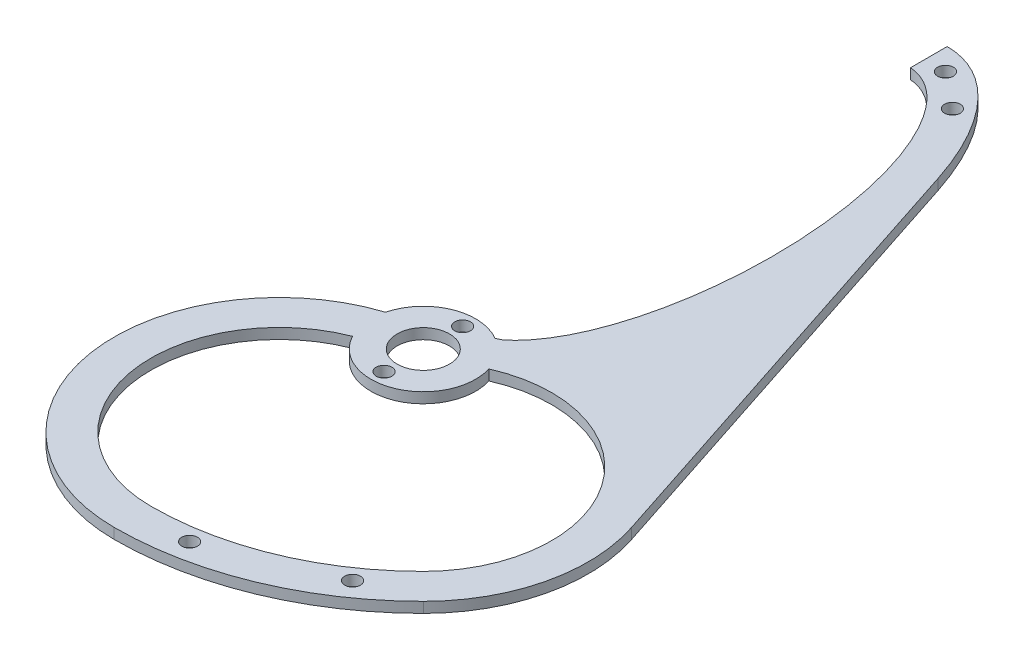
ISO-10303-21;
HEADER;
FILE_DESCRIPTION(('STEP AP214'),'2;1');
FILE_NAME('part.step','',(''),(''),'','','');
FILE_SCHEMA(('AUTOMOTIVE_DESIGN { 1 0 10303 214 1 1 1 1 }'));
ENDSEC;
DATA;
#1=APPLICATION_CONTEXT('core data for automotive mechanical design processes');
#2=APPLICATION_PROTOCOL_DEFINITION('international standard','automotive_design',2000,#1);
#3=PRODUCT_CONTEXT('',#1,'mechanical');
#4=PRODUCT('Part','Part','',(#3));
#5=PRODUCT_RELATED_PRODUCT_CATEGORY('part','',(#4));
#6=PRODUCT_DEFINITION_FORMATION('','',#4);
#7=PRODUCT_DEFINITION_CONTEXT('part definition',#1,'design');
#8=PRODUCT_DEFINITION('design','',#6,#7);
#9=PRODUCT_DEFINITION_SHAPE('','',#8);
#10=(LENGTH_UNIT() NAMED_UNIT(*) SI_UNIT(.MILLI.,.METRE.));
#11=(NAMED_UNIT(*) PLANE_ANGLE_UNIT() SI_UNIT($,.RADIAN.));
#12=(NAMED_UNIT(*) SI_UNIT($,.STERADIAN.) SOLID_ANGLE_UNIT());
#13=UNCERTAINTY_MEASURE_WITH_UNIT(LENGTH_MEASURE(1.E-05),#10,'distance_accuracy_value','');
#14=(GEOMETRIC_REPRESENTATION_CONTEXT(3) GLOBAL_UNCERTAINTY_ASSIGNED_CONTEXT((#13)) GLOBAL_UNIT_ASSIGNED_CONTEXT((#10,
#11,#12)) REPRESENTATION_CONTEXT('',''));
#15=CARTESIAN_POINT('',(0.,0.,0.));
#16=DIRECTION('',(0.,0.,1.));
#17=DIRECTION('',(1.,0.,0.));
#18=AXIS2_PLACEMENT_3D('',#15,#16,#17);
#19=CARTESIAN_POINT('',(0.,2.,-50.));
#20=DIRECTION('',(0.,1.,0.));
#21=DIRECTION('',(0.,0.,1.));
#22=AXIS2_PLACEMENT_3D('',#19,#20,#21);
#23=PLANE('',#22);
#24=CARTESIAN_POINT('',(10.7802293046451,2.,-90.2323634821783));
#25=DIRECTION('',(0.,-1.,0.));
#26=DIRECTION('',(0.,0.,-1.));
#27=AXIS2_PLACEMENT_3D('',#24,#25,#26);
#28=CIRCLE('',#27,1.5);
#29=CARTESIAN_POINT('',(10.7802293046451,2.,-91.7323634821783));
#30=VERTEX_POINT('',#29);
#31=EDGE_CURVE('E488',#30,#30,#28,.T.);
#32=ORIENTED_EDGE('',*,*,#31,.T.);
#33=EDGE_LOOP('',(#32));
#34=FACE_BOUND('',#33,.T.);
#35=CARTESIAN_POINT('',(3.99729247476001,2.,-95.6892620559412));
#36=DIRECTION('',(0.,-1.,0.));
#37=DIRECTION('',(0.,0.,-1.));
#38=AXIS2_PLACEMENT_3D('',#35,#36,#37);
#39=CIRCLE('',#38,1.5);
#40=CARTESIAN_POINT('',(3.99729247476001,2.,-97.1892620559412));
#41=VERTEX_POINT('',#40);
#42=EDGE_CURVE('E496',#41,#41,#39,.T.);
#43=ORIENTED_EDGE('',*,*,#42,.T.);
#44=EDGE_LOOP('',(#43));
#45=FACE_BOUND('',#44,.T.);
#46=CARTESIAN_POINT('',(0.,2.,7.5));
#47=DIRECTION('',(0.,1.,0.));
#48=DIRECTION('',(0.,0.,1.));
#49=AXIS2_PLACEMENT_3D('',#46,#47,#48);
#50=CIRCLE('',#49,1.5);
#51=CARTESIAN_POINT('',(0.,2.,9.));
#52=VERTEX_POINT('',#51);
#53=EDGE_CURVE('E508',#52,#52,#50,.T.);
#54=ORIENTED_EDGE('',*,*,#53,.F.);
#55=EDGE_LOOP('',(#54));
#56=FACE_BOUND('',#55,.T.);
#57=CARTESIAN_POINT('',(0.,2.,0.));
#58=DIRECTION('',(0.,1.,0.));
#59=DIRECTION('',(0.,0.,1.));
#60=AXIS2_PLACEMENT_3D('',#57,#58,#59);
#61=CIRCLE('',#60,52.);
#62=CARTESIAN_POINT('',(0.,2.,52.));
#63=VERTEX_POINT('',#62);
#64=CARTESIAN_POINT('',(36.7695526217005,2.,36.7695526217005));
#65=VERTEX_POINT('',#64);
#66=EDGE_CURVE('E138',#63,#65,#61,.T.);
#67=ORIENTED_EDGE('',*,*,#66,.F.);
#68=CARTESIAN_POINT('',(0.,2.,27.5));
#69=DIRECTION('',(0.,1.,0.));
#70=DIRECTION('',(0.,0.,-1.));
#71=AXIS2_PLACEMENT_3D('',#68,#69,#70);
#72=CIRCLE('',#71,24.5);
#73=CARTESIAN_POINT('',(-8.85071785854508,2.,4.65454545454543));
#74=VERTEX_POINT('',#73);
#75=EDGE_CURVE('E130',#74,#63,#72,.T.);
#76=ORIENTED_EDGE('',*,*,#75,.F.);
#77=CARTESIAN_POINT('',(0.,2.,0.));
#78=DIRECTION('',(0.,-1.,0.));
#79=DIRECTION('',(0.,0.,1.));
#80=AXIS2_PLACEMENT_3D('',#77,#78,#79);
#81=CIRCLE('',#80,9.99999999999992);
#82=CARTESIAN_POINT('',(9.54966327039619,2.,-2.96714196189605));
#83=VERTEX_POINT('',#82);
#84=EDGE_CURVE('E153',#83,#74,#81,.T.);
#85=ORIENTED_EDGE('',*,*,#84,.F.);
#86=CARTESIAN_POINT('',(19.4454364826301,2.,19.44543648263));
#87=DIRECTION('',(0.,1.,0.));
#88=DIRECTION('',(0.,0.,1.));
#89=AXIS2_PLACEMENT_3D('',#86,#87,#88);
#90=CIRCLE('',#89,24.5);
#91=EDGE_CURVE('E151',#65,#83,#90,.T.);
#92=ORIENTED_EDGE('',*,*,#91,.F.);
#93=EDGE_LOOP('',(#67,#76,#85,#92));
#94=FACE_BOUND('',#93,.T.);
#95=CARTESIAN_POINT('',(31.5467039993079,2.,45.0533624358943));
#96=DIRECTION('',(0.,1.,0.));
#97=DIRECTION('',(0.,0.,-1.));
#98=AXIS2_PLACEMENT_3D('',#95,#96,#97);
#99=CIRCLE('',#98,1.5);
#100=CARTESIAN_POINT('',(31.5467039993079,2.,43.5533624358943));
#101=VERTEX_POINT('',#100);
#102=EDGE_CURVE('E169',#101,#101,#99,.T.);
#103=ORIENTED_EDGE('',*,*,#102,.F.);
#104=EDGE_LOOP('',(#103));
#105=FACE_BOUND('',#104,.T.);
#106=CARTESIAN_POINT('',(0.,2.,27.5));
#107=DIRECTION('',(0.,1.,0.));
#108=DIRECTION('',(0.,0.,-1.));
#109=AXIS2_PLACEMENT_3D('',#106,#107,#108);
#110=CIRCLE('',#109,31.5);
#111=CARTESIAN_POINT('',(-9.68945921270682,2.,-2.4727272727273));
#112=VERTEX_POINT('',#111);
#113=CARTESIAN_POINT('',(0.,2.,59.));
#114=VERTEX_POINT('',#113);
#115=EDGE_CURVE('E181',#112,#114,#110,.T.);
#116=ORIENTED_EDGE('',*,*,#115,.T.);
#117=CARTESIAN_POINT('',(0.,2.,0.));
#118=DIRECTION('',(0.,1.,0.));
#119=DIRECTION('',(0.,0.,1.));
#120=AXIS2_PLACEMENT_3D('',#117,#118,#119);
#121=CIRCLE('',#120,59.);
#122=CARTESIAN_POINT('',(41.7193000900064,2.,41.7193000900062));
#123=VERTEX_POINT('',#122);
#124=EDGE_CURVE('E184',#114,#123,#121,.T.);
#125=ORIENTED_EDGE('',*,*,#124,.T.);
#126=CARTESIAN_POINT('',(19.4454364826301,2.,19.44543648263));
#127=DIRECTION('',(0.,1.,0.));
#128=DIRECTION('',(0.,0.,1.));
#129=AXIS2_PLACEMENT_3D('',#126,#127,#128);
#130=CIRCLE('',#129,31.5);
#131=CARTESIAN_POINT('',(49.3845442563364,2.,9.65259084336872));
#132=VERTEX_POINT('',#131);
#133=EDGE_CURVE('E187',#123,#132,#130,.T.);
#134=ORIENTED_EDGE('',*,*,#133,.T.);
#135=DIRECTION('',(-0.310883988547977,0.,-0.950447865831946));
#136=VECTOR('',#135,1.);
#137=CARTESIAN_POINT('',(20.9205105577853,2.,-77.3688740063126));
#138=LINE('',#137,#136);
#139=CARTESIAN_POINT('',(20.9205105577853,2.,-77.3688740063126));
#140=VERTEX_POINT('',#139);
#141=EDGE_CURVE('E189',#132,#140,#138,.T.);
#142=ORIENTED_EDGE('',*,*,#141,.T.);
#143=CARTESIAN_POINT('',(0.,2.,-50.));
#144=DIRECTION('',(0.,1.,0.));
#145=DIRECTION('',(-7.9671973330076E-05,0.,-0.999999996826188));
#146=AXIS2_PLACEMENT_3D('',#143,#144,#145);
#147=ELLIPSE('',#146,50.0000004760718,25.0000000793453);
#148=CARTESIAN_POINT('',(0.,2.,-100.));
#149=VERTEX_POINT('',#148);
#150=EDGE_CURVE('E191',#140,#149,#147,.T.);
#151=ORIENTED_EDGE('',*,*,#150,.T.);
#152=DIRECTION('',(0.,0.,1.));
#153=VECTOR('',#152,1.);
#154=CARTESIAN_POINT('',(0.,2.,-93.0000000000292));
#155=LINE('',#154,#153);
#156=CARTESIAN_POINT('',(0.,2.,-93.0000000000292));
#157=VERTEX_POINT('',#156);
#158=EDGE_CURVE('E194',#149,#157,#155,.T.);
#159=ORIENTED_EDGE('',*,*,#158,.T.);
#160=CARTESIAN_POINT('',(0.,2.,-50.));
#161=DIRECTION('',(0.,-1.,0.));
#162=DIRECTION('',(0.0150081111125231,0.,0.999887371957879));
#163=AXIS2_PLACEMENT_3D('',#160,#161,#162);
#164=ELLIPSE('',#163,43.0227949668846,18.007170315413);
#165=CARTESIAN_POINT('',(6.03243215555724,2.,-9.05616548852738));
#166=VERTEX_POINT('',#165);
#167=EDGE_CURVE('E243',#157,#166,#164,.T.);
#168=ORIENTED_EDGE('',*,*,#167,.T.);
#169=CARTESIAN_POINT('',(19.4454364826301,2.,19.44543648263));
#170=DIRECTION('',(0.,1.,0.));
#171=DIRECTION('',(0.,0.,1.));
#172=AXIS2_PLACEMENT_3D('',#169,#170,#171);
#173=CIRCLE('',#172,31.5000000000029);
#174=CARTESIAN_POINT('',(5.10300009276374,2.,-8.5999645379084));
#175=VERTEX_POINT('',#174);
#176=EDGE_CURVE('E246',#166,#175,#173,.T.);
#177=ORIENTED_EDGE('',*,*,#176,.T.);
#178=CARTESIAN_POINT('',(0.,2.,0.));
#179=DIRECTION('',(0.,1.,0.));
#180=DIRECTION('',(0.,0.,1.));
#181=AXIS2_PLACEMENT_3D('',#178,#179,#180);
#182=CIRCLE('',#181,9.99999999999992);
#183=EDGE_CURVE('E248',#175,#112,#182,.T.);
#184=ORIENTED_EDGE('',*,*,#183,.T.);
#185=EDGE_LOOP('',(#116,#125,#134,#142,#151,#159,#168,#177,#184));
#186=FACE_BOUND('',#185,.T.);
#187=CARTESIAN_POINT('',(9.55064977168081,2.,54.1644264156715));
#188=DIRECTION('',(0.,1.,0.));
#189=DIRECTION('',(0.,0.,1.));
#190=AXIS2_PLACEMENT_3D('',#187,#188,#189);
#191=CIRCLE('',#190,1.5);
#192=CARTESIAN_POINT('',(9.55064977168081,2.,55.6644264156715));
#193=VERTEX_POINT('',#192);
#194=EDGE_CURVE('E175',#193,#193,#191,.T.);
#195=ORIENTED_EDGE('',*,*,#194,.F.);
#196=EDGE_LOOP('',(#195));
#197=FACE_BOUND('',#196,.T.);
#198=CARTESIAN_POINT('',(0.,2.,0.));
#199=DIRECTION('',(0.,1.,0.));
#200=DIRECTION('',(0.,0.,1.));
#201=AXIS2_PLACEMENT_3D('',#198,#199,#200);
#202=CIRCLE('',#201,5.);
#203=CARTESIAN_POINT('',(0.,2.,5.));
#204=VERTEX_POINT('',#203);
#205=EDGE_CURVE('E159',#204,#204,#202,.T.);
#206=ORIENTED_EDGE('',*,*,#205,.F.);
#207=EDGE_LOOP('',(#206));
#208=FACE_BOUND('',#207,.T.);
#209=CARTESIAN_POINT('',(0.,2.,-7.5));
#210=DIRECTION('',(0.,1.,0.));
#211=DIRECTION('',(0.,0.,1.));
#212=AXIS2_PLACEMENT_3D('',#209,#210,#211);
#213=CIRCLE('',#212,1.5);
#214=CARTESIAN_POINT('',(0.,2.,-6.));
#215=VERTEX_POINT('',#214);
#216=EDGE_CURVE('E502',#215,#215,#213,.T.);
#217=ORIENTED_EDGE('',*,*,#216,.F.);
#218=EDGE_LOOP('',(#217));
#219=FACE_BOUND('',#218,.T.);
#220=ADVANCED_FACE('F35',(#34,#45,#56,#94,#105,#186,#197,#208,#219),#23,.T.);
#221=CARTESIAN_POINT('',(0.,0.,-50.));
#222=DIRECTION('',(0.,1.,0.));
#223=DIRECTION('',(0.,0.,1.));
#224=AXIS2_PLACEMENT_3D('',#221,#222,#223);
#225=PLANE('',#224);
#226=CARTESIAN_POINT('',(10.7802293046451,0.,-90.2323634821783));
#227=DIRECTION('',(0.,-1.,0.));
#228=DIRECTION('',(0.,0.,-1.));
#229=AXIS2_PLACEMENT_3D('',#226,#227,#228);
#230=CIRCLE('',#229,1.5);
#231=CARTESIAN_POINT('',(10.7802293046451,0.,-91.7323634821783));
#232=VERTEX_POINT('',#231);
#233=EDGE_CURVE('E491',#232,#232,#230,.T.);
#234=ORIENTED_EDGE('',*,*,#233,.F.);
#235=EDGE_LOOP('',(#234));
#236=FACE_BOUND('',#235,.T.);
#237=CARTESIAN_POINT('',(3.99729247476001,0.,-95.6892620559412));
#238=DIRECTION('',(0.,-1.,0.));
#239=DIRECTION('',(0.,0.,-1.));
#240=AXIS2_PLACEMENT_3D('',#237,#238,#239);
#241=CIRCLE('',#240,1.5);
#242=CARTESIAN_POINT('',(3.99729247476001,0.,-97.1892620559412));
#243=VERTEX_POINT('',#242);
#244=EDGE_CURVE('E493',#243,#243,#241,.T.);
#245=ORIENTED_EDGE('',*,*,#244,.F.);
#246=EDGE_LOOP('',(#245));
#247=FACE_BOUND('',#246,.T.);
#248=CARTESIAN_POINT('',(31.5467039993079,0.,45.0533624358943));
#249=DIRECTION('',(0.,1.,0.));
#250=DIRECTION('',(0.,0.,-1.));
#251=AXIS2_PLACEMENT_3D('',#248,#249,#250);
#252=CIRCLE('',#251,1.5);
#253=CARTESIAN_POINT('',(31.5467039993079,0.,43.5533624358943));
#254=VERTEX_POINT('',#253);
#255=EDGE_CURVE('E146',#254,#254,#252,.T.);
#256=ORIENTED_EDGE('',*,*,#255,.T.);
#257=EDGE_LOOP('',(#256));
#258=FACE_BOUND('',#257,.T.);
#259=CARTESIAN_POINT('',(9.55064977168081,0.,54.1644264156715));
#260=DIRECTION('',(0.,1.,0.));
#261=DIRECTION('',(0.,0.,1.));
#262=AXIS2_PLACEMENT_3D('',#259,#260,#261);
#263=CIRCLE('',#262,1.5);
#264=CARTESIAN_POINT('',(9.55064977168081,0.,55.6644264156715));
#265=VERTEX_POINT('',#264);
#266=EDGE_CURVE('E172',#265,#265,#263,.T.);
#267=ORIENTED_EDGE('',*,*,#266,.T.);
#268=EDGE_LOOP('',(#267));
#269=FACE_BOUND('',#268,.T.);
#270=CARTESIAN_POINT('',(0.,0.,27.5));
#271=DIRECTION('',(0.,1.,0.));
#272=DIRECTION('',(0.,0.,-1.));
#273=AXIS2_PLACEMENT_3D('',#270,#271,#272);
#274=CIRCLE('',#273,31.5);
#275=CARTESIAN_POINT('',(-9.68945921270682,0.,-2.4727272727273));
#276=VERTEX_POINT('',#275);
#277=CARTESIAN_POINT('',(0.,0.,59.));
#278=VERTEX_POINT('',#277);
#279=EDGE_CURVE('E178',#276,#278,#274,.T.);
#280=ORIENTED_EDGE('',*,*,#279,.F.);
#281=CARTESIAN_POINT('',(0.,0.,0.));
#282=DIRECTION('',(0.,1.,0.));
#283=DIRECTION('',(0.,0.,1.));
#284=AXIS2_PLACEMENT_3D('',#281,#282,#283);
#285=CIRCLE('',#284,9.99999999999992);
#286=CARTESIAN_POINT('',(5.10300009276374,0.,-8.5999645379084));
#287=VERTEX_POINT('',#286);
#288=EDGE_CURVE('E185',#287,#276,#285,.T.);
#289=ORIENTED_EDGE('',*,*,#288,.F.);
#290=CARTESIAN_POINT('',(19.4454364826301,0.,19.44543648263));
#291=DIRECTION('',(0.,1.,0.));
#292=DIRECTION('',(0.,0.,1.));
#293=AXIS2_PLACEMENT_3D('',#290,#291,#292);
#294=CIRCLE('',#293,31.5000000000029);
#295=CARTESIAN_POINT('',(6.03243215555724,0.,-9.05616548852738));
#296=VERTEX_POINT('',#295);
#297=EDGE_CURVE('E265',#296,#287,#294,.T.);
#298=ORIENTED_EDGE('',*,*,#297,.F.);
#299=CARTESIAN_POINT('',(0.,0.,-50.));
#300=DIRECTION('',(0.,-1.,0.));
#301=DIRECTION('',(0.0150081111125231,0.,0.999887371957879));
#302=AXIS2_PLACEMENT_3D('',#299,#300,#301);
#303=ELLIPSE('',#302,43.0227949668846,18.007170315413);
#304=CARTESIAN_POINT('',(0.,0.,-93.0000000000292));
#305=VERTEX_POINT('',#304);
#306=EDGE_CURVE('E263',#305,#296,#303,.T.);
#307=ORIENTED_EDGE('',*,*,#306,.F.);
#308=DIRECTION('',(0.,0.,1.));
#309=VECTOR('',#308,1.);
#310=CARTESIAN_POINT('',(0.,0.,-93.0000000000292));
#311=LINE('',#310,#309);
#312=CARTESIAN_POINT('',(0.,0.,-100.));
#313=VERTEX_POINT('',#312);
#314=EDGE_CURVE('E261',#313,#305,#311,.T.);
#315=ORIENTED_EDGE('',*,*,#314,.F.);
#316=CARTESIAN_POINT('',(0.,0.,-50.));
#317=DIRECTION('',(0.,1.,0.));
#318=DIRECTION('',(-7.9671973330076E-05,0.,-0.999999996826188));
#319=AXIS2_PLACEMENT_3D('',#316,#317,#318);
#320=ELLIPSE('',#319,50.0000004760718,25.0000000793453);
#321=CARTESIAN_POINT('',(20.9205105577853,0.,-77.3688740063126));
#322=VERTEX_POINT('',#321);
#323=EDGE_CURVE('E259',#322,#313,#320,.T.);
#324=ORIENTED_EDGE('',*,*,#323,.F.);
#325=DIRECTION('',(-0.310883988547977,0.,-0.950447865831946));
#326=VECTOR('',#325,1.);
#327=CARTESIAN_POINT('',(20.9205105577853,0.,-77.3688740063126));
#328=LINE('',#327,#326);
#329=CARTESIAN_POINT('',(49.3845442563364,0.,9.65259084336872));
#330=VERTEX_POINT('',#329);
#331=EDGE_CURVE('E257',#330,#322,#328,.T.);
#332=ORIENTED_EDGE('',*,*,#331,.F.);
#333=CARTESIAN_POINT('',(19.4454364826301,0.,19.44543648263));
#334=DIRECTION('',(0.,1.,0.));
#335=DIRECTION('',(0.,0.,1.));
#336=AXIS2_PLACEMENT_3D('',#333,#334,#335);
#337=CIRCLE('',#336,31.5);
#338=CARTESIAN_POINT('',(41.7193000900064,0.,41.7193000900062));
#339=VERTEX_POINT('',#338);
#340=EDGE_CURVE('E255',#339,#330,#337,.T.);
#341=ORIENTED_EDGE('',*,*,#340,.F.);
#342=CARTESIAN_POINT('',(0.,0.,0.));
#343=DIRECTION('',(0.,1.,0.));
#344=DIRECTION('',(0.,0.,1.));
#345=AXIS2_PLACEMENT_3D('',#342,#343,#344);
#346=CIRCLE('',#345,59.);
#347=EDGE_CURVE('E253',#278,#339,#346,.T.);
#348=ORIENTED_EDGE('',*,*,#347,.F.);
#349=EDGE_LOOP('',(#280,#289,#298,#307,#315,#324,#332,#341,#348));
#350=FACE_BOUND('',#349,.T.);
#351=CARTESIAN_POINT('',(0.,0.,27.5));
#352=DIRECTION('',(0.,1.,0.));
#353=DIRECTION('',(0.,0.,-1.));
#354=AXIS2_PLACEMENT_3D('',#351,#352,#353);
#355=CIRCLE('',#354,24.5);
#356=CARTESIAN_POINT('',(-8.85071785854508,0.,4.65454545454543));
#357=VERTEX_POINT('',#356);
#358=CARTESIAN_POINT('',(0.,0.,52.));
#359=VERTEX_POINT('',#358);
#360=EDGE_CURVE('E58',#357,#359,#355,.T.);
#361=ORIENTED_EDGE('',*,*,#360,.T.);
#362=CARTESIAN_POINT('',(0.,0.,0.));
#363=DIRECTION('',(0.,1.,0.));
#364=DIRECTION('',(0.,0.,1.));
#365=AXIS2_PLACEMENT_3D('',#362,#363,#364);
#366=CIRCLE('',#365,52.);
#367=CARTESIAN_POINT('',(36.7695526217005,0.,36.7695526217005));
#368=VERTEX_POINT('',#367);
#369=EDGE_CURVE('E145',#359,#368,#366,.T.);
#370=ORIENTED_EDGE('',*,*,#369,.T.);
#371=CARTESIAN_POINT('',(19.4454364826301,0.,19.44543648263));
#372=DIRECTION('',(0.,1.,0.));
#373=DIRECTION('',(0.,0.,1.));
#374=AXIS2_PLACEMENT_3D('',#371,#372,#373);
#375=CIRCLE('',#374,24.5);
#376=CARTESIAN_POINT('',(9.5496632703962,0.,-2.96714196189605));
#377=VERTEX_POINT('',#376);
#378=EDGE_CURVE('E161',#368,#377,#375,.T.);
#379=ORIENTED_EDGE('',*,*,#378,.T.);
#380=CARTESIAN_POINT('',(0.,0.,0.));
#381=DIRECTION('',(0.,-1.,0.));
#382=DIRECTION('',(0.,0.,1.));
#383=AXIS2_PLACEMENT_3D('',#380,#381,#382);
#384=CIRCLE('',#383,9.99999999999992);
#385=EDGE_CURVE('E139',#377,#357,#384,.T.);
#386=ORIENTED_EDGE('',*,*,#385,.T.);
#387=EDGE_LOOP('',(#361,#370,#379,#386));
#388=FACE_BOUND('',#387,.T.);
#389=CARTESIAN_POINT('',(0.,0.,0.));
#390=DIRECTION('',(0.,1.,0.));
#391=DIRECTION('',(0.,0.,1.));
#392=AXIS2_PLACEMENT_3D('',#389,#390,#391);
#393=CIRCLE('',#392,5.);
#394=CARTESIAN_POINT('',(0.,0.,5.));
#395=VERTEX_POINT('',#394);
#396=EDGE_CURVE('E511',#395,#395,#393,.T.);
#397=ORIENTED_EDGE('',*,*,#396,.T.);
#398=EDGE_LOOP('',(#397));
#399=FACE_BOUND('',#398,.T.);
#400=CARTESIAN_POINT('',(0.,0.,7.5));
#401=DIRECTION('',(0.,1.,0.));
#402=DIRECTION('',(0.,0.,1.));
#403=AXIS2_PLACEMENT_3D('',#400,#401,#402);
#404=CIRCLE('',#403,1.5);
#405=CARTESIAN_POINT('',(0.,0.,9.));
#406=VERTEX_POINT('',#405);
#407=EDGE_CURVE('E505',#406,#406,#404,.T.);
#408=ORIENTED_EDGE('',*,*,#407,.T.);
#409=EDGE_LOOP('',(#408));
#410=FACE_BOUND('',#409,.T.);
#411=CARTESIAN_POINT('',(0.,0.,-7.5));
#412=DIRECTION('',(0.,1.,0.));
#413=DIRECTION('',(0.,0.,1.));
#414=AXIS2_PLACEMENT_3D('',#411,#412,#413);
#415=CIRCLE('',#414,1.5);
#416=CARTESIAN_POINT('',(0.,0.,-6.));
#417=VERTEX_POINT('',#416);
#418=EDGE_CURVE('E499',#417,#417,#415,.T.);
#419=ORIENTED_EDGE('',*,*,#418,.T.);
#420=EDGE_LOOP('',(#419));
#421=FACE_BOUND('',#420,.T.);
#422=ADVANCED_FACE('F217',(#236,#247,#258,#269,#350,#388,#399,#410,#421),#225,.F.);
#423=CARTESIAN_POINT('',(0.,2.,27.5));
#424=DIRECTION('',(0.,-1.,0.));
#425=DIRECTION('',(0.,0.,-1.));
#426=AXIS2_PLACEMENT_3D('',#423,#424,#425);
#427=CYLINDRICAL_SURFACE('',#426,31.5);
#428=ORIENTED_EDGE('',*,*,#279,.T.);
#429=DIRECTION('',(0.,-1.,0.));
#430=VECTOR('',#429,1.);
#431=CARTESIAN_POINT('',(0.,2.,59.));
#432=LINE('',#431,#430);
#433=EDGE_CURVE('E11',#114,#278,#432,.T.);
#434=ORIENTED_EDGE('',*,*,#433,.F.);
#435=ORIENTED_EDGE('',*,*,#115,.F.);
#436=DIRECTION('',(0.,-1.,0.));
#437=VECTOR('',#436,1.);
#438=CARTESIAN_POINT('',(-9.68945921270682,2.,-2.4727272727273));
#439=LINE('',#438,#437);
#440=EDGE_CURVE('E250',#112,#276,#439,.T.);
#441=ORIENTED_EDGE('',*,*,#440,.T.);
#442=EDGE_LOOP('',(#428,#434,#435,#441));
#443=FACE_BOUND('',#442,.T.);
#444=ADVANCED_FACE('F37',(#443),#427,.T.);
#445=CARTESIAN_POINT('',(0.,2.,0.));
#446=DIRECTION('',(0.,-1.,0.));
#447=DIRECTION('',(0.,0.,-1.));
#448=AXIS2_PLACEMENT_3D('',#445,#446,#447);
#449=CYLINDRICAL_SURFACE('',#448,59.);
#450=ORIENTED_EDGE('',*,*,#347,.T.);
#451=DIRECTION('',(0.,-1.,0.));
#452=VECTOR('',#451,1.);
#453=CARTESIAN_POINT('',(41.7193000900064,2.,41.7193000900062));
#454=LINE('',#453,#452);
#455=EDGE_CURVE('E43',#123,#339,#454,.T.);
#456=ORIENTED_EDGE('',*,*,#455,.F.);
#457=ORIENTED_EDGE('',*,*,#124,.F.);
#458=ORIENTED_EDGE('',*,*,#433,.T.);
#459=EDGE_LOOP('',(#450,#456,#457,#458));
#460=FACE_BOUND('',#459,.T.);
#461=ADVANCED_FACE('F210',(#460),#449,.T.);
#462=CARTESIAN_POINT('',(19.4454364826301,2.,19.44543648263));
#463=DIRECTION('',(0.,-1.,0.));
#464=DIRECTION('',(0.,0.,-1.));
#465=AXIS2_PLACEMENT_3D('',#462,#463,#464);
#466=CYLINDRICAL_SURFACE('',#465,31.5);
#467=ORIENTED_EDGE('',*,*,#340,.T.);
#468=DIRECTION('',(0.,-1.,0.));
#469=VECTOR('',#468,1.);
#470=CARTESIAN_POINT('',(49.3845442563364,2.,9.65259084336872));
#471=LINE('',#470,#469);
#472=EDGE_CURVE('E285',#132,#330,#471,.T.);
#473=ORIENTED_EDGE('',*,*,#472,.F.);
#474=ORIENTED_EDGE('',*,*,#133,.F.);
#475=ORIENTED_EDGE('',*,*,#455,.T.);
#476=EDGE_LOOP('',(#467,#473,#474,#475));
#477=FACE_BOUND('',#476,.T.);
#478=ADVANCED_FACE('F207',(#477),#466,.T.);
#479=CARTESIAN_POINT('',(20.9205105577853,2.,-77.3688740063126));
#480=DIRECTION('',(-0.950447865831946,0.,0.310883988547977));
#481=DIRECTION('',(0.310883988547977,0.,0.950447865831946));
#482=AXIS2_PLACEMENT_3D('',#479,#480,#481);
#483=PLANE('',#482);
#484=ORIENTED_EDGE('',*,*,#331,.T.);
#485=DIRECTION('',(0.,-1.,0.));
#486=VECTOR('',#485,1.);
#487=CARTESIAN_POINT('',(20.9205105577853,2.,-77.3688740063126));
#488=LINE('',#487,#486);
#489=EDGE_CURVE('E282',#140,#322,#488,.T.);
#490=ORIENTED_EDGE('',*,*,#489,.F.);
#491=ORIENTED_EDGE('',*,*,#141,.F.);
#492=ORIENTED_EDGE('',*,*,#472,.T.);
#493=EDGE_LOOP('',(#484,#490,#491,#492));
#494=FACE_BOUND('',#493,.T.);
#495=ADVANCED_FACE('F202',(#494),#483,.F.);
#496=DIRECTION('',(0.,-1.,0.));
#497=VECTOR('',#496,1.);
#498=SURFACE_OF_LINEAR_EXTRUSION('',#147,#497);
#499=ORIENTED_EDGE('',*,*,#323,.T.);
#500=DIRECTION('',(0.,-1.,0.));
#501=VECTOR('',#500,1.);
#502=CARTESIAN_POINT('',(0.,2.,-100.));
#503=LINE('',#502,#501);
#504=EDGE_CURVE('E279',#149,#313,#503,.T.);
#505=ORIENTED_EDGE('',*,*,#504,.F.);
#506=ORIENTED_EDGE('',*,*,#150,.F.);
#507=ORIENTED_EDGE('',*,*,#489,.T.);
#508=EDGE_LOOP('',(#499,#505,#506,#507));
#509=FACE_BOUND('',#508,.T.);
#510=ADVANCED_FACE('F197',(#509),#498,.F.);
#511=CARTESIAN_POINT('',(0.,2.,-93.0000000000292));
#512=DIRECTION('',(1.,0.,0.));
#513=DIRECTION('',(0.,0.,-1.));
#514=AXIS2_PLACEMENT_3D('',#511,#512,#513);
#515=PLANE('',#514);
#516=ORIENTED_EDGE('',*,*,#314,.T.);
#517=DIRECTION('',(0.,-1.,0.));
#518=VECTOR('',#517,1.);
#519=CARTESIAN_POINT('',(0.,2.,-93.0000000000292));
#520=LINE('',#519,#518);
#521=EDGE_CURVE('E276',#157,#305,#520,.T.);
#522=ORIENTED_EDGE('',*,*,#521,.F.);
#523=ORIENTED_EDGE('',*,*,#158,.F.);
#524=ORIENTED_EDGE('',*,*,#504,.T.);
#525=EDGE_LOOP('',(#516,#522,#523,#524));
#526=FACE_BOUND('',#525,.T.);
#527=ADVANCED_FACE('F201',(#526),#515,.F.);
#528=DIRECTION('',(0.,-1.,0.));
#529=VECTOR('',#528,1.);
#530=SURFACE_OF_LINEAR_EXTRUSION('',#164,#529);
#531=ORIENTED_EDGE('',*,*,#306,.T.);
#532=DIRECTION('',(0.,-1.,0.));
#533=VECTOR('',#532,1.);
#534=CARTESIAN_POINT('',(6.03243215555724,2.,-9.05616548852738));
#535=LINE('',#534,#533);
#536=EDGE_CURVE('E273',#166,#296,#535,.T.);
#537=ORIENTED_EDGE('',*,*,#536,.F.);
#538=ORIENTED_EDGE('',*,*,#167,.F.);
#539=ORIENTED_EDGE('',*,*,#521,.T.);
#540=EDGE_LOOP('',(#531,#537,#538,#539));
#541=FACE_BOUND('',#540,.T.);
#542=ADVANCED_FACE('F239',(#541),#530,.F.);
#543=CARTESIAN_POINT('',(19.4454364826301,2.,19.44543648263));
#544=DIRECTION('',(0.,-1.,0.));
#545=DIRECTION('',(0.,0.,-1.));
#546=AXIS2_PLACEMENT_3D('',#543,#544,#545);
#547=CYLINDRICAL_SURFACE('',#546,31.5000000000029);
#548=ORIENTED_EDGE('',*,*,#297,.T.);
#549=DIRECTION('',(0.,-1.,0.));
#550=VECTOR('',#549,1.);
#551=CARTESIAN_POINT('',(5.10300009276374,2.,-8.5999645379084));
#552=LINE('',#551,#550);
#553=EDGE_CURVE('E270',#175,#287,#552,.T.);
#554=ORIENTED_EDGE('',*,*,#553,.F.);
#555=ORIENTED_EDGE('',*,*,#176,.F.);
#556=ORIENTED_EDGE('',*,*,#536,.T.);
#557=EDGE_LOOP('',(#548,#554,#555,#556));
#558=FACE_BOUND('',#557,.T.);
#559=ADVANCED_FACE('F236',(#558),#547,.T.);
#560=CARTESIAN_POINT('',(0.,2.,0.));
#561=DIRECTION('',(0.,-1.,0.));
#562=DIRECTION('',(0.,0.,-1.));
#563=AXIS2_PLACEMENT_3D('',#560,#561,#562);
#564=CYLINDRICAL_SURFACE('',#563,9.99999999999992);
#565=ORIENTED_EDGE('',*,*,#288,.T.);
#566=ORIENTED_EDGE('',*,*,#440,.F.);
#567=ORIENTED_EDGE('',*,*,#183,.F.);
#568=ORIENTED_EDGE('',*,*,#553,.T.);
#569=EDGE_LOOP('',(#565,#566,#567,#568));
#570=FACE_BOUND('',#569,.T.);
#571=ADVANCED_FACE('F233',(#570),#564,.T.);
#572=CARTESIAN_POINT('',(9.55064977168081,2.,54.1644264156715));
#573=DIRECTION('',(0.,-1.,0.));
#574=DIRECTION('',(0.,0.,-1.));
#575=AXIS2_PLACEMENT_3D('',#572,#573,#574);
#576=CYLINDRICAL_SURFACE('',#575,1.5);
#577=ORIENTED_EDGE('',*,*,#194,.T.);
#578=EDGE_LOOP('',(#577));
#579=FACE_BOUND('',#578,.T.);
#580=ORIENTED_EDGE('',*,*,#266,.F.);
#581=EDGE_LOOP('',(#580));
#582=FACE_BOUND('',#581,.T.);
#583=ADVANCED_FACE('F230',(#579,#582),#576,.F.);
#584=CARTESIAN_POINT('',(31.5467039993079,2.,45.0533624358943));
#585=DIRECTION('',(0.,-1.,0.));
#586=DIRECTION('',(0.,0.,-1.));
#587=AXIS2_PLACEMENT_3D('',#584,#585,#586);
#588=CYLINDRICAL_SURFACE('',#587,1.5);
#589=ORIENTED_EDGE('',*,*,#102,.T.);
#590=EDGE_LOOP('',(#589));
#591=FACE_BOUND('',#590,.T.);
#592=ORIENTED_EDGE('',*,*,#255,.F.);
#593=EDGE_LOOP('',(#592));
#594=FACE_BOUND('',#593,.T.);
#595=ADVANCED_FACE('F341',(#591,#594),#588,.F.);
#596=CARTESIAN_POINT('',(0.,2.,27.5));
#597=DIRECTION('',(0.,-1.,0.));
#598=DIRECTION('',(0.,0.,-1.));
#599=AXIS2_PLACEMENT_3D('',#596,#597,#598);
#600=CYLINDRICAL_SURFACE('',#599,24.5);
#601=ORIENTED_EDGE('',*,*,#360,.F.);
#602=DIRECTION('',(0.,-1.,0.));
#603=VECTOR('',#602,1.);
#604=CARTESIAN_POINT('',(-8.85071785854508,2.,4.65454545454543));
#605=LINE('',#604,#603);
#606=EDGE_CURVE('E134',#74,#357,#605,.T.);
#607=ORIENTED_EDGE('',*,*,#606,.F.);
#608=ORIENTED_EDGE('',*,*,#75,.T.);
#609=DIRECTION('',(0.,-1.,0.));
#610=VECTOR('',#609,1.);
#611=CARTESIAN_POINT('',(0.,2.,52.));
#612=LINE('',#611,#610);
#613=EDGE_CURVE('E133',#63,#359,#612,.T.);
#614=ORIENTED_EDGE('',*,*,#613,.T.);
#615=EDGE_LOOP('',(#601,#607,#608,#614));
#616=FACE_BOUND('',#615,.T.);
#617=ADVANCED_FACE('F132',(#616),#600,.F.);
#618=CARTESIAN_POINT('',(0.,2.,0.));
#619=DIRECTION('',(0.,-1.,0.));
#620=DIRECTION('',(0.,0.,-1.));
#621=AXIS2_PLACEMENT_3D('',#618,#619,#620);
#622=CYLINDRICAL_SURFACE('',#621,52.);
#623=ORIENTED_EDGE('',*,*,#369,.F.);
#624=ORIENTED_EDGE('',*,*,#613,.F.);
#625=ORIENTED_EDGE('',*,*,#66,.T.);
#626=DIRECTION('',(0.,-1.,0.));
#627=VECTOR('',#626,1.);
#628=CARTESIAN_POINT('',(36.7695526217005,2.,36.7695526217005));
#629=LINE('',#628,#627);
#630=EDGE_CURVE('E147',#65,#368,#629,.T.);
#631=ORIENTED_EDGE('',*,*,#630,.T.);
#632=EDGE_LOOP('',(#623,#624,#625,#631));
#633=FACE_BOUND('',#632,.T.);
#634=ADVANCED_FACE('F142',(#633),#622,.F.);
#635=CARTESIAN_POINT('',(19.4454364826301,2.,19.44543648263));
#636=DIRECTION('',(0.,-1.,0.));
#637=DIRECTION('',(0.,0.,-1.));
#638=AXIS2_PLACEMENT_3D('',#635,#636,#637);
#639=CYLINDRICAL_SURFACE('',#638,24.5);
#640=ORIENTED_EDGE('',*,*,#378,.F.);
#641=ORIENTED_EDGE('',*,*,#630,.F.);
#642=ORIENTED_EDGE('',*,*,#91,.T.);
#643=DIRECTION('',(0.,-1.,0.));
#644=VECTOR('',#643,1.);
#645=CARTESIAN_POINT('',(9.5496632703962,2.,-2.96714196189605));
#646=LINE('',#645,#644);
#647=EDGE_CURVE('E50',#83,#377,#646,.T.);
#648=ORIENTED_EDGE('',*,*,#647,.T.);
#649=EDGE_LOOP('',(#640,#641,#642,#648));
#650=FACE_BOUND('',#649,.T.);
#651=ADVANCED_FACE('F360',(#650),#639,.F.);
#652=CARTESIAN_POINT('',(0.,2.,0.));
#653=DIRECTION('',(0.,-1.,0.));
#654=DIRECTION('',(0.,0.,-1.));
#655=AXIS2_PLACEMENT_3D('',#652,#653,#654);
#656=CYLINDRICAL_SURFACE('',#655,9.99999999999992);
#657=ORIENTED_EDGE('',*,*,#385,.F.);
#658=ORIENTED_EDGE('',*,*,#647,.F.);
#659=ORIENTED_EDGE('',*,*,#84,.T.);
#660=ORIENTED_EDGE('',*,*,#606,.T.);
#661=EDGE_LOOP('',(#657,#658,#659,#660));
#662=FACE_BOUND('',#661,.T.);
#663=ADVANCED_FACE('F367',(#662),#656,.T.);
#664=CARTESIAN_POINT('',(0.,2.,0.));
#665=DIRECTION('',(0.,-1.,0.));
#666=DIRECTION('',(0.,0.,-1.));
#667=AXIS2_PLACEMENT_3D('',#664,#665,#666);
#668=CYLINDRICAL_SURFACE('',#667,5.);
#669=ORIENTED_EDGE('',*,*,#205,.T.);
#670=EDGE_LOOP('',(#669));
#671=FACE_BOUND('',#670,.T.);
#672=ORIENTED_EDGE('',*,*,#396,.F.);
#673=EDGE_LOOP('',(#672));
#674=FACE_BOUND('',#673,.T.);
#675=ADVANCED_FACE('F375',(#671,#674),#668,.F.);
#676=CARTESIAN_POINT('',(0.,2.,7.5));
#677=DIRECTION('',(0.,-1.,0.));
#678=DIRECTION('',(0.,0.,-1.));
#679=AXIS2_PLACEMENT_3D('',#676,#677,#678);
#680=CYLINDRICAL_SURFACE('',#679,1.5);
#681=ORIENTED_EDGE('',*,*,#53,.T.);
#682=EDGE_LOOP('',(#681));
#683=FACE_BOUND('',#682,.T.);
#684=ORIENTED_EDGE('',*,*,#407,.F.);
#685=EDGE_LOOP('',(#684));
#686=FACE_BOUND('',#685,.T.);
#687=ADVANCED_FACE('F382',(#683,#686),#680,.F.);
#688=CARTESIAN_POINT('',(0.,2.,-7.5));
#689=DIRECTION('',(0.,-1.,0.));
#690=DIRECTION('',(0.,0.,-1.));
#691=AXIS2_PLACEMENT_3D('',#688,#689,#690);
#692=CYLINDRICAL_SURFACE('',#691,1.5);
#693=ORIENTED_EDGE('',*,*,#216,.T.);
#694=EDGE_LOOP('',(#693));
#695=FACE_BOUND('',#694,.T.);
#696=ORIENTED_EDGE('',*,*,#418,.F.);
#697=EDGE_LOOP('',(#696));
#698=FACE_BOUND('',#697,.T.);
#699=ADVANCED_FACE('F390',(#695,#698),#692,.F.);
#700=CARTESIAN_POINT('',(3.99729247476001,2.,-95.6892620559412));
#701=DIRECTION('',(0.,-1.,0.));
#702=DIRECTION('',(0.,0.,-1.));
#703=AXIS2_PLACEMENT_3D('',#700,#701,#702);
#704=CYLINDRICAL_SURFACE('',#703,1.5);
#705=ORIENTED_EDGE('',*,*,#42,.F.);
#706=EDGE_LOOP('',(#705));
#707=FACE_BOUND('',#706,.T.);
#708=ORIENTED_EDGE('',*,*,#244,.T.);
#709=EDGE_LOOP('',(#708));
#710=FACE_BOUND('',#709,.T.);
#711=ADVANCED_FACE('F398',(#707,#710),#704,.F.);
#712=CARTESIAN_POINT('',(10.7802293046451,2.,-90.2323634821783));
#713=DIRECTION('',(0.,-1.,0.));
#714=DIRECTION('',(0.,0.,-1.));
#715=AXIS2_PLACEMENT_3D('',#712,#713,#714);
#716=CYLINDRICAL_SURFACE('',#715,1.5);
#717=ORIENTED_EDGE('',*,*,#31,.F.);
#718=EDGE_LOOP('',(#717));
#719=FACE_BOUND('',#718,.T.);
#720=ORIENTED_EDGE('',*,*,#233,.T.);
#721=EDGE_LOOP('',(#720));
#722=FACE_BOUND('',#721,.T.);
#723=ADVANCED_FACE('F406',(#719,#722),#716,.F.);
#724=CLOSED_SHELL('',(#220,#422,#444,#461,#478,#495,#510,#527,#542,#559,#571,#583,#595,#617,
#634,#651,#663,#675,#687,#699,#711,#723));
#725=MANIFOLD_SOLID_BREP('B2',#724);
#726=ADVANCED_BREP_SHAPE_REPRESENTATION('',(#18,#725),#14);
#727=SHAPE_DEFINITION_REPRESENTATION(#9,#726);
ENDSEC;
END-ISO-10303-21;
